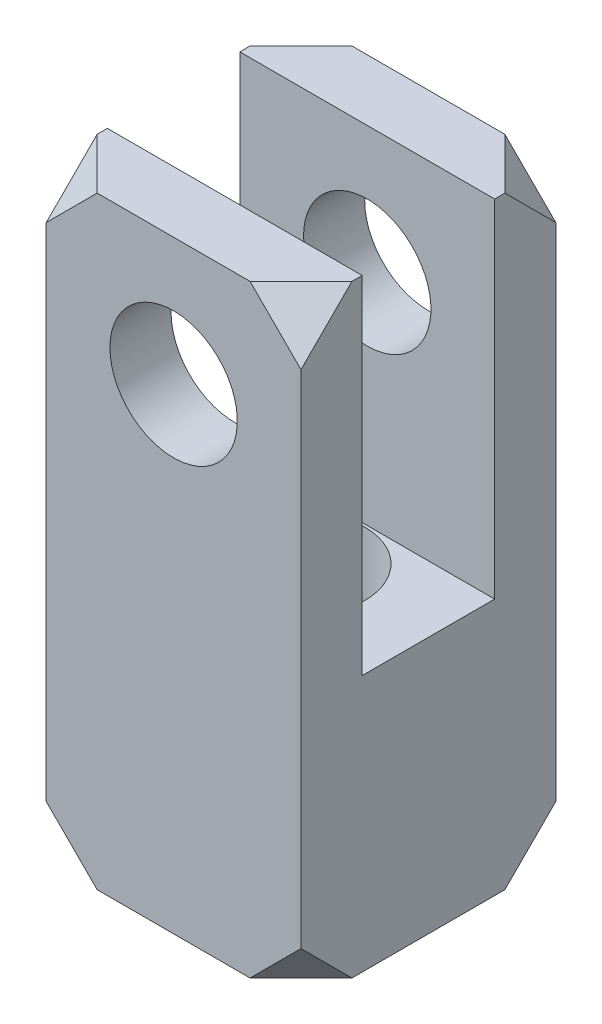
ISO-10303-21;
HEADER;
FILE_DESCRIPTION(('STEP AP214'),'2;1');
FILE_NAME('part.step','',(''),(''),'','','');
FILE_SCHEMA(('AUTOMOTIVE_DESIGN { 1 0 10303 214 1 1 1 1 }'));
ENDSEC;
DATA;
#1=APPLICATION_CONTEXT('core data for automotive mechanical design processes');
#2=APPLICATION_PROTOCOL_DEFINITION('international standard','automotive_design',2000,#1);
#3=PRODUCT_CONTEXT('',#1,'mechanical');
#4=PRODUCT('Part','Part','',(#3));
#5=PRODUCT_RELATED_PRODUCT_CATEGORY('part','',(#4));
#6=PRODUCT_DEFINITION_FORMATION('','',#4);
#7=PRODUCT_DEFINITION_CONTEXT('part definition',#1,'design');
#8=PRODUCT_DEFINITION('design','',#6,#7);
#9=PRODUCT_DEFINITION_SHAPE('','',#8);
#10=(LENGTH_UNIT() NAMED_UNIT(*) SI_UNIT(.MILLI.,.METRE.));
#11=(NAMED_UNIT(*) PLANE_ANGLE_UNIT() SI_UNIT($,.RADIAN.));
#12=(NAMED_UNIT(*) SI_UNIT($,.STERADIAN.) SOLID_ANGLE_UNIT());
#13=UNCERTAINTY_MEASURE_WITH_UNIT(LENGTH_MEASURE(1.E-05),#10,'distance_accuracy_value','');
#14=(GEOMETRIC_REPRESENTATION_CONTEXT(3) GLOBAL_UNCERTAINTY_ASSIGNED_CONTEXT((#13)) GLOBAL_UNIT_ASSIGNED_CONTEXT((#10,
#11,#12)) REPRESENTATION_CONTEXT('',''));
#15=CARTESIAN_POINT('',(0.,0.,0.));
#16=DIRECTION('',(0.,0.,1.));
#17=DIRECTION('',(1.,0.,0.));
#18=AXIS2_PLACEMENT_3D('',#15,#16,#17);
#19=CARTESIAN_POINT('',(0.,0.,12.7));
#20=DIRECTION('',(0.,-1.,0.));
#21=DIRECTION('',(0.,0.,-1.));
#22=AXIS2_PLACEMENT_3D('',#19,#20,#21);
#23=PLANE('',#22);
#24=DIRECTION('',(0.,0.,-1.));
#25=VECTOR('',#24,1.);
#26=CARTESIAN_POINT('',(0.,0.,12.7));
#27=LINE('',#26,#25);
#28=CARTESIAN_POINT('',(0.,0.,3.048));
#29=VERTEX_POINT('',#28);
#30=CARTESIAN_POINT('',(0.,0.,2.54));
#31=VERTEX_POINT('',#30);
#32=EDGE_CURVE('E183',#29,#31,#27,.T.);
#33=ORIENTED_EDGE('',*,*,#32,.F.);
#34=DIRECTION('',(-1.,0.,0.));
#35=VECTOR('',#34,1.);
#36=CARTESIAN_POINT('',(0.,0.,3.048));
#37=LINE('',#36,#35);
#38=CARTESIAN_POINT('',(12.7,0.,3.048));
#39=VERTEX_POINT('',#38);
#40=EDGE_CURVE('E161',#39,#29,#37,.T.);
#41=ORIENTED_EDGE('',*,*,#40,.F.);
#42=DIRECTION('',(0.,0.,-1.));
#43=VECTOR('',#42,1.);
#44=CARTESIAN_POINT('',(12.7,0.,12.7));
#45=LINE('',#44,#43);
#46=CARTESIAN_POINT('',(12.7,0.,2.54));
#47=VERTEX_POINT('',#46);
#48=EDGE_CURVE('E195',#39,#47,#45,.T.);
#49=ORIENTED_EDGE('',*,*,#48,.T.);
#50=DIRECTION('',(0.707106781186548,0.,0.707106781186547));
#51=VECTOR('',#50,1.);
#52=CARTESIAN_POINT('',(11.43,0.,1.27));
#53=LINE('',#52,#51);
#54=CARTESIAN_POINT('',(10.16,0.,0.));
#55=VERTEX_POINT('',#54);
#56=EDGE_CURVE('E230',#55,#47,#53,.T.);
#57=ORIENTED_EDGE('',*,*,#56,.F.);
#58=DIRECTION('',(-1.,0.,0.));
#59=VECTOR('',#58,1.);
#60=CARTESIAN_POINT('',(0.,0.,0.));
#61=LINE('',#60,#59);
#62=CARTESIAN_POINT('',(2.54,0.,0.));
#63=VERTEX_POINT('',#62);
#64=EDGE_CURVE('E176',#55,#63,#61,.T.);
#65=ORIENTED_EDGE('',*,*,#64,.T.);
#66=DIRECTION('',(0.707106781186548,0.,-0.707106781186548));
#67=VECTOR('',#66,1.);
#68=CARTESIAN_POINT('',(-5.08,0.,7.62));
#69=LINE('',#68,#67);
#70=EDGE_CURVE('E221',#31,#63,#69,.T.);
#71=ORIENTED_EDGE('',*,*,#70,.F.);
#72=EDGE_LOOP('',(#33,#41,#49,#57,#65,#71));
#73=FACE_BOUND('',#72,.T.);
#74=ADVANCED_FACE('F33',(#73),#23,.F.);
#75=CARTESIAN_POINT('',(0.,0.,12.7));
#76=DIRECTION('',(0.,0.,1.));
#77=DIRECTION('',(1.,0.,0.));
#78=AXIS2_PLACEMENT_3D('',#75,#76,#77);
#79=PLANE('',#78);
#80=CARTESIAN_POINT('',(6.35,-6.35,12.7));
#81=DIRECTION('',(0.,0.,-1.));
#82=DIRECTION('',(-1.,0.,0.));
#83=AXIS2_PLACEMENT_3D('',#80,#81,#82);
#84=CIRCLE('',#83,3.175);
#85=CARTESIAN_POINT('',(3.175,-6.35,12.7));
#86=VERTEX_POINT('',#85);
#87=EDGE_CURVE('E270',#86,#86,#84,.T.);
#88=ORIENTED_EDGE('',*,*,#87,.T.);
#89=EDGE_LOOP('',(#88));
#90=FACE_BOUND('',#89,.T.);
#91=DIRECTION('',(0.,-1.,0.));
#92=VECTOR('',#91,1.);
#93=CARTESIAN_POINT('',(0.,0.,12.7));
#94=LINE('',#93,#92);
#95=CARTESIAN_POINT('',(0.,-2.54,12.7));
#96=VERTEX_POINT('',#95);
#97=CARTESIAN_POINT('',(0.,-27.5336,12.7));
#98=VERTEX_POINT('',#97);
#99=EDGE_CURVE('E172',#96,#98,#94,.T.);
#100=ORIENTED_EDGE('',*,*,#99,.T.);
#101=DIRECTION('',(0.707106781186548,-0.707106781186547,0.));
#102=VECTOR('',#101,1.);
#103=CARTESIAN_POINT('',(-13.7668,-13.7668,12.7));
#104=LINE('',#103,#102);
#105=CARTESIAN_POINT('',(2.54,-30.0736,12.7));
#106=VERTEX_POINT('',#105);
#107=EDGE_CURVE('E263',#98,#106,#104,.T.);
#108=ORIENTED_EDGE('',*,*,#107,.T.);
#109=DIRECTION('',(1.,0.,0.));
#110=VECTOR('',#109,1.);
#111=CARTESIAN_POINT('',(0.,-30.0736,12.7));
#112=LINE('',#111,#110);
#113=CARTESIAN_POINT('',(10.16,-30.0736,12.7));
#114=VERTEX_POINT('',#113);
#115=EDGE_CURVE('E175',#106,#114,#112,.T.);
#116=ORIENTED_EDGE('',*,*,#115,.T.);
#117=DIRECTION('',(0.707106781186548,0.707106781186547,0.));
#118=VECTOR('',#117,1.);
#119=CARTESIAN_POINT('',(20.1168,-20.1168,12.7));
#120=LINE('',#119,#118);
#121=CARTESIAN_POINT('',(12.7,-27.5336,12.7));
#122=VERTEX_POINT('',#121);
#123=EDGE_CURVE('E254',#114,#122,#120,.T.);
#124=ORIENTED_EDGE('',*,*,#123,.T.);
#125=DIRECTION('',(0.,1.,0.));
#126=VECTOR('',#125,1.);
#127=CARTESIAN_POINT('',(12.7,0.,12.7));
#128=LINE('',#127,#126);
#129=CARTESIAN_POINT('',(12.7,-2.54,12.7));
#130=VERTEX_POINT('',#129);
#131=EDGE_CURVE('E178',#122,#130,#128,.T.);
#132=ORIENTED_EDGE('',*,*,#131,.T.);
#133=DIRECTION('',(-0.707106781186548,0.707106781186547,0.));
#134=VECTOR('',#133,1.);
#135=CARTESIAN_POINT('',(5.08,5.08,12.7));
#136=LINE('',#135,#134);
#137=CARTESIAN_POINT('',(10.16,0.,12.7));
#138=VERTEX_POINT('',#137);
#139=EDGE_CURVE('E207',#130,#138,#136,.T.);
#140=ORIENTED_EDGE('',*,*,#139,.T.);
#141=DIRECTION('',(-1.,0.,0.));
#142=VECTOR('',#141,1.);
#143=CARTESIAN_POINT('',(0.,0.,12.7));
#144=LINE('',#143,#142);
#145=CARTESIAN_POINT('',(2.54,0.,12.7));
#146=VERTEX_POINT('',#145);
#147=EDGE_CURVE('E180',#138,#146,#144,.T.);
#148=ORIENTED_EDGE('',*,*,#147,.T.);
#149=DIRECTION('',(-0.707106781186547,-0.707106781186548,0.));
#150=VECTOR('',#149,1.);
#151=CARTESIAN_POINT('',(1.27,-1.27,12.7));
#152=LINE('',#151,#150);
#153=EDGE_CURVE('E210',#146,#96,#152,.T.);
#154=ORIENTED_EDGE('',*,*,#153,.T.);
#155=EDGE_LOOP('',(#100,#108,#116,#124,#132,#140,#148,#154));
#156=FACE_BOUND('',#155,.T.);
#157=ADVANCED_FACE('F322',(#90,#156),#79,.T.);
#158=CARTESIAN_POINT('',(0.,0.,12.7));
#159=DIRECTION('',(1.,0.,0.));
#160=DIRECTION('',(0.,1.,0.));
#161=AXIS2_PLACEMENT_3D('',#158,#159,#160);
#162=PLANE('',#161);
#163=DIRECTION('',(0.,0.,1.));
#164=VECTOR('',#163,1.);
#165=CARTESIAN_POINT('',(0.,-17.272,9.652));
#166=LINE('',#165,#164);
#167=CARTESIAN_POINT('',(0.,-17.272,3.048));
#168=VERTEX_POINT('',#167);
#169=CARTESIAN_POINT('',(0.,-17.272,9.652));
#170=VERTEX_POINT('',#169);
#171=EDGE_CURVE('E152',#168,#170,#166,.T.);
#172=ORIENTED_EDGE('',*,*,#171,.F.);
#173=DIRECTION('',(0.,1.,0.));
#174=VECTOR('',#173,1.);
#175=CARTESIAN_POINT('',(0.,-17.272,3.048));
#176=LINE('',#175,#174);
#177=EDGE_CURVE('E188',#168,#29,#176,.T.);
#178=ORIENTED_EDGE('',*,*,#177,.T.);
#179=ORIENTED_EDGE('',*,*,#32,.T.);
#180=DIRECTION('',(0.,0.707106781186548,0.707106781186548));
#181=VECTOR('',#180,1.);
#182=CARTESIAN_POINT('',(0.,5.08,7.62));
#183=LINE('',#182,#181);
#184=CARTESIAN_POINT('',(0.,-2.54,0.));
#185=VERTEX_POINT('',#184);
#186=EDGE_CURVE('E218',#185,#31,#183,.T.);
#187=ORIENTED_EDGE('',*,*,#186,.F.);
#188=DIRECTION('',(0.,-1.,0.));
#189=VECTOR('',#188,1.);
#190=CARTESIAN_POINT('',(0.,0.,0.));
#191=LINE('',#190,#189);
#192=CARTESIAN_POINT('',(0.,-27.5336,0.));
#193=VERTEX_POINT('',#192);
#194=EDGE_CURVE('E184',#185,#193,#191,.T.);
#195=ORIENTED_EDGE('',*,*,#194,.T.);
#196=DIRECTION('',(0.,0.707106781186547,-0.707106781186548));
#197=VECTOR('',#196,1.);
#198=CARTESIAN_POINT('',(0.,-20.1168,-7.4168));
#199=LINE('',#198,#197);
#200=CARTESIAN_POINT('',(0.,-30.0736,2.54));
#201=VERTEX_POINT('',#200);
#202=EDGE_CURVE('E236',#201,#193,#199,.T.);
#203=ORIENTED_EDGE('',*,*,#202,.F.);
#204=DIRECTION('',(0.,0.,-1.));
#205=VECTOR('',#204,1.);
#206=CARTESIAN_POINT('',(0.,-30.0736,12.7));
#207=LINE('',#206,#205);
#208=CARTESIAN_POINT('',(0.,-30.0736,10.16));
#209=VERTEX_POINT('',#208);
#210=EDGE_CURVE('E201',#209,#201,#207,.T.);
#211=ORIENTED_EDGE('',*,*,#210,.F.);
#212=DIRECTION('',(0.,-0.707106781186547,-0.707106781186548));
#213=VECTOR('',#212,1.);
#214=CARTESIAN_POINT('',(0.,-13.7668,26.4668));
#215=LINE('',#214,#213);
#216=EDGE_CURVE('E42',#98,#209,#215,.T.);
#217=ORIENTED_EDGE('',*,*,#216,.F.);
#218=ORIENTED_EDGE('',*,*,#99,.F.);
#219=DIRECTION('',(0.,-0.707106781186547,0.707106781186548));
#220=VECTOR('',#219,1.);
#221=CARTESIAN_POINT('',(0.,-1.27,11.43));
#222=LINE('',#221,#220);
#223=CARTESIAN_POINT('',(0.,0.,10.16));
#224=VERTEX_POINT('',#223);
#225=EDGE_CURVE('E212',#224,#96,#222,.T.);
#226=ORIENTED_EDGE('',*,*,#225,.F.);
#227=CARTESIAN_POINT('',(0.,0.,9.652));
#228=VERTEX_POINT('',#227);
#229=EDGE_CURVE('E165',#224,#228,#27,.T.);
#230=ORIENTED_EDGE('',*,*,#229,.T.);
#231=DIRECTION('',(0.,1.,0.));
#232=VECTOR('',#231,1.);
#233=CARTESIAN_POINT('',(0.,-17.272,9.652));
#234=LINE('',#233,#232);
#235=EDGE_CURVE('E50',#170,#228,#234,.T.);
#236=ORIENTED_EDGE('',*,*,#235,.F.);
#237=EDGE_LOOP('',(#172,#178,#179,#187,#195,#203,#211,#217,#218,#226,#230,#236));
#238=FACE_BOUND('',#237,.T.);
#239=ADVANCED_FACE('F35',(#238),#162,.F.);
#240=CARTESIAN_POINT('',(0.,-30.0736,12.7));
#241=DIRECTION('',(0.,1.,0.));
#242=DIRECTION('',(0.,0.,1.));
#243=AXIS2_PLACEMENT_3D('',#240,#241,#242);
#244=PLANE('',#243);
#245=CARTESIAN_POINT('',(6.35,-30.0736,6.35));
#246=DIRECTION('',(0.,-1.,0.));
#247=DIRECTION('',(0.,0.,-1.));
#248=AXIS2_PLACEMENT_3D('',#245,#246,#247);
#249=CIRCLE('',#248,3.175);
#250=CARTESIAN_POINT('',(6.35,-30.0736,3.175));
#251=VERTEX_POINT('',#250);
#252=EDGE_CURVE('E284',#251,#251,#249,.T.);
#253=ORIENTED_EDGE('',*,*,#252,.F.);
#254=EDGE_LOOP('',(#253));
#255=FACE_BOUND('',#254,.T.);
#256=DIRECTION('',(0.707106781186547,0.,0.707106781186548));
#257=VECTOR('',#256,1.);
#258=CARTESIAN_POINT('',(1.27,-30.0736,11.43));
#259=LINE('',#258,#257);
#260=EDGE_CURVE('E11',#209,#106,#259,.T.);
#261=ORIENTED_EDGE('',*,*,#260,.F.);
#262=ORIENTED_EDGE('',*,*,#210,.T.);
#263=DIRECTION('',(-0.707106781186547,0.,0.707106781186548));
#264=VECTOR('',#263,1.);
#265=CARTESIAN_POINT('',(-5.08,-30.0736,7.62));
#266=LINE('',#265,#264);
#267=CARTESIAN_POINT('',(2.54000000000001,-30.0736,0.));
#268=VERTEX_POINT('',#267);
#269=EDGE_CURVE('E239',#268,#201,#266,.T.);
#270=ORIENTED_EDGE('',*,*,#269,.F.);
#271=DIRECTION('',(1.,0.,0.));
#272=VECTOR('',#271,1.);
#273=CARTESIAN_POINT('',(0.,-30.0736,0.));
#274=LINE('',#273,#272);
#275=CARTESIAN_POINT('',(10.16,-30.0736,0.));
#276=VERTEX_POINT('',#275);
#277=EDGE_CURVE('E187',#268,#276,#274,.T.);
#278=ORIENTED_EDGE('',*,*,#277,.T.);
#279=DIRECTION('',(-0.707106781186548,0.,-0.707106781186547));
#280=VECTOR('',#279,1.);
#281=CARTESIAN_POINT('',(11.43,-30.0736,1.27));
#282=LINE('',#281,#280);
#283=CARTESIAN_POINT('',(12.7,-30.0736,2.53999999999999));
#284=VERTEX_POINT('',#283);
#285=EDGE_CURVE('E245',#284,#276,#282,.T.);
#286=ORIENTED_EDGE('',*,*,#285,.F.);
#287=DIRECTION('',(0.,0.,-1.));
#288=VECTOR('',#287,1.);
#289=CARTESIAN_POINT('',(12.7,-30.0736,12.7));
#290=LINE('',#289,#288);
#291=CARTESIAN_POINT('',(12.7,-30.0736,10.16));
#292=VERTEX_POINT('',#291);
#293=EDGE_CURVE('E199',#292,#284,#290,.T.);
#294=ORIENTED_EDGE('',*,*,#293,.F.);
#295=DIRECTION('',(0.707106781186548,0.,-0.707106781186548));
#296=VECTOR('',#295,1.);
#297=CARTESIAN_POINT('',(5.08,-30.0736,17.78));
#298=LINE('',#297,#296);
#299=EDGE_CURVE('E257',#114,#292,#298,.T.);
#300=ORIENTED_EDGE('',*,*,#299,.F.);
#301=ORIENTED_EDGE('',*,*,#115,.F.);
#302=EDGE_LOOP('',(#261,#262,#270,#278,#286,#294,#300,#301));
#303=FACE_BOUND('',#302,.T.);
#304=ADVANCED_FACE('F315',(#255,#303),#244,.F.);
#305=CARTESIAN_POINT('',(12.7,0.,12.7));
#306=DIRECTION('',(-1.,0.,0.));
#307=DIRECTION('',(0.,-1.,0.));
#308=AXIS2_PLACEMENT_3D('',#305,#306,#307);
#309=PLANE('',#308);
#310=ORIENTED_EDGE('',*,*,#48,.F.);
#311=DIRECTION('',(0.,1.,0.));
#312=VECTOR('',#311,1.);
#313=CARTESIAN_POINT('',(12.7,-17.272,3.048));
#314=LINE('',#313,#312);
#315=CARTESIAN_POINT('',(12.7,-17.272,3.048));
#316=VERTEX_POINT('',#315);
#317=EDGE_CURVE('E167',#316,#39,#314,.T.);
#318=ORIENTED_EDGE('',*,*,#317,.F.);
#319=DIRECTION('',(0.,0.,-1.));
#320=VECTOR('',#319,1.);
#321=CARTESIAN_POINT('',(12.7,-17.272,9.652));
#322=LINE('',#321,#320);
#323=CARTESIAN_POINT('',(12.7,-17.272,9.652));
#324=VERTEX_POINT('',#323);
#325=EDGE_CURVE('E151',#324,#316,#322,.T.);
#326=ORIENTED_EDGE('',*,*,#325,.F.);
#327=DIRECTION('',(0.,1.,0.));
#328=VECTOR('',#327,1.);
#329=CARTESIAN_POINT('',(12.7,-17.272,9.652));
#330=LINE('',#329,#328);
#331=CARTESIAN_POINT('',(12.7,0.,9.652));
#332=VERTEX_POINT('',#331);
#333=EDGE_CURVE('E148',#324,#332,#330,.T.);
#334=ORIENTED_EDGE('',*,*,#333,.T.);
#335=CARTESIAN_POINT('',(12.7,0.,10.16));
#336=VERTEX_POINT('',#335);
#337=EDGE_CURVE('E196',#336,#332,#45,.T.);
#338=ORIENTED_EDGE('',*,*,#337,.F.);
#339=DIRECTION('',(0.,0.707106781186547,-0.707106781186547));
#340=VECTOR('',#339,1.);
#341=CARTESIAN_POINT('',(12.7,-1.27,11.43));
#342=LINE('',#341,#340);
#343=EDGE_CURVE('E203',#130,#336,#342,.T.);
#344=ORIENTED_EDGE('',*,*,#343,.F.);
#345=ORIENTED_EDGE('',*,*,#131,.F.);
#346=DIRECTION('',(0.,0.707106781186547,0.707106781186548));
#347=VECTOR('',#346,1.);
#348=CARTESIAN_POINT('',(12.7,-13.7668,26.4668));
#349=LINE('',#348,#347);
#350=EDGE_CURVE('E260',#292,#122,#349,.T.);
#351=ORIENTED_EDGE('',*,*,#350,.F.);
#352=ORIENTED_EDGE('',*,*,#293,.T.);
#353=DIRECTION('',(0.,-0.707106781186547,0.707106781186548));
#354=VECTOR('',#353,1.);
#355=CARTESIAN_POINT('',(12.7,-20.1168,-7.4168));
#356=LINE('',#355,#354);
#357=CARTESIAN_POINT('',(12.7,-27.5336,0.));
#358=VERTEX_POINT('',#357);
#359=EDGE_CURVE('E248',#358,#284,#356,.T.);
#360=ORIENTED_EDGE('',*,*,#359,.F.);
#361=DIRECTION('',(0.,1.,0.));
#362=VECTOR('',#361,1.);
#363=CARTESIAN_POINT('',(12.7,0.,0.));
#364=LINE('',#363,#362);
#365=CARTESIAN_POINT('',(12.7,-2.54,0.));
#366=VERTEX_POINT('',#365);
#367=EDGE_CURVE('E191',#358,#366,#364,.T.);
#368=ORIENTED_EDGE('',*,*,#367,.T.);
#369=DIRECTION('',(0.,-0.707106781186548,-0.707106781186547));
#370=VECTOR('',#369,1.);
#371=CARTESIAN_POINT('',(12.7,5.08,7.62));
#372=LINE('',#371,#370);
#373=EDGE_CURVE('E227',#47,#366,#372,.T.);
#374=ORIENTED_EDGE('',*,*,#373,.F.);
#375=EDGE_LOOP('',(#310,#318,#326,#334,#338,#344,#345,#351,#352,#360,#368,#374));
#376=FACE_BOUND('',#375,.T.);
#377=ADVANCED_FACE('F300',(#376),#309,.F.);
#378=ORIENTED_EDGE('',*,*,#337,.T.);
#379=DIRECTION('',(1.,0.,0.));
#380=VECTOR('',#379,1.);
#381=CARTESIAN_POINT('',(0.,0.,9.652));
#382=LINE('',#381,#380);
#383=EDGE_CURVE('E274',#228,#332,#382,.T.);
#384=ORIENTED_EDGE('',*,*,#383,.F.);
#385=ORIENTED_EDGE('',*,*,#229,.F.);
#386=DIRECTION('',(-0.707106781186547,0.,-0.707106781186548));
#387=VECTOR('',#386,1.);
#388=CARTESIAN_POINT('',(1.27,0.,11.43));
#389=LINE('',#388,#387);
#390=EDGE_CURVE('E215',#146,#224,#389,.T.);
#391=ORIENTED_EDGE('',*,*,#390,.F.);
#392=ORIENTED_EDGE('',*,*,#147,.F.);
#393=DIRECTION('',(-0.707106781186547,0.,0.707106781186547));
#394=VECTOR('',#393,1.);
#395=CARTESIAN_POINT('',(5.08,0.,17.78));
#396=LINE('',#395,#394);
#397=EDGE_CURVE('E205',#336,#138,#396,.T.);
#398=ORIENTED_EDGE('',*,*,#397,.F.);
#399=EDGE_LOOP('',(#378,#384,#385,#391,#392,#398));
#400=FACE_BOUND('',#399,.T.);
#401=ADVANCED_FACE('F329',(#400),#23,.F.);
#402=CARTESIAN_POINT('',(0.,0.,0.));
#403=DIRECTION('',(0.,0.,1.));
#404=DIRECTION('',(1.,0.,0.));
#405=AXIS2_PLACEMENT_3D('',#402,#403,#404);
#406=PLANE('',#405);
#407=CARTESIAN_POINT('',(6.35,-6.35,0.));
#408=DIRECTION('',(0.,0.,-1.));
#409=DIRECTION('',(-1.,0.,0.));
#410=AXIS2_PLACEMENT_3D('',#407,#408,#409);
#411=CIRCLE('',#410,3.175);
#412=CARTESIAN_POINT('',(3.175,-6.35,0.));
#413=VERTEX_POINT('',#412);
#414=EDGE_CURVE('E277',#413,#413,#411,.T.);
#415=ORIENTED_EDGE('',*,*,#414,.F.);
#416=EDGE_LOOP('',(#415));
#417=FACE_BOUND('',#416,.T.);
#418=DIRECTION('',(0.707106781186548,0.707106781186547,0.));
#419=VECTOR('',#418,1.);
#420=CARTESIAN_POINT('',(20.1168,-20.1168,0.));
#421=LINE('',#420,#419);
#422=EDGE_CURVE('E251',#276,#358,#421,.T.);
#423=ORIENTED_EDGE('',*,*,#422,.F.);
#424=ORIENTED_EDGE('',*,*,#277,.F.);
#425=DIRECTION('',(0.707106781186548,-0.707106781186547,0.));
#426=VECTOR('',#425,1.);
#427=CARTESIAN_POINT('',(-13.7668,-13.7668,0.));
#428=LINE('',#427,#426);
#429=EDGE_CURVE('E242',#193,#268,#428,.T.);
#430=ORIENTED_EDGE('',*,*,#429,.F.);
#431=ORIENTED_EDGE('',*,*,#194,.F.);
#432=DIRECTION('',(-0.707106781186547,-0.707106781186548,0.));
#433=VECTOR('',#432,1.);
#434=CARTESIAN_POINT('',(1.27,-1.27,0.));
#435=LINE('',#434,#433);
#436=EDGE_CURVE('E224',#63,#185,#435,.T.);
#437=ORIENTED_EDGE('',*,*,#436,.F.);
#438=ORIENTED_EDGE('',*,*,#64,.F.);
#439=DIRECTION('',(-0.707106781186548,0.707106781186547,0.));
#440=VECTOR('',#439,1.);
#441=CARTESIAN_POINT('',(5.08,5.08,0.));
#442=LINE('',#441,#440);
#443=EDGE_CURVE('E233',#366,#55,#442,.T.);
#444=ORIENTED_EDGE('',*,*,#443,.F.);
#445=ORIENTED_EDGE('',*,*,#367,.F.);
#446=EDGE_LOOP('',(#423,#424,#430,#431,#437,#438,#444,#445));
#447=FACE_BOUND('',#446,.T.);
#448=ADVANCED_FACE('F307',(#417,#447),#406,.F.);
#449=CARTESIAN_POINT('',(7.62,7.62,7.62));
#450=DIRECTION('',(0.577350269189626,0.577350269189626,0.577350269189626));
#451=DIRECTION('',(0.,-0.707106781186547,0.707106781186548));
#452=AXIS2_PLACEMENT_3D('',#449,#450,#451);
#453=PLANE('',#452);
#454=ORIENTED_EDGE('',*,*,#139,.F.);
#455=ORIENTED_EDGE('',*,*,#343,.T.);
#456=ORIENTED_EDGE('',*,*,#397,.T.);
#457=EDGE_LOOP('',(#454,#455,#456));
#458=FACE_BOUND('',#457,.T.);
#459=ADVANCED_FACE('F334',(#458),#453,.T.);
#460=CARTESIAN_POINT('',(-3.38666666666667,3.38666666666667,3.38666666666667));
#461=DIRECTION('',(-0.577350269189626,0.577350269189626,0.577350269189626));
#462=DIRECTION('',(-0.707106781186547,-0.707106781186548,0.));
#463=AXIS2_PLACEMENT_3D('',#460,#461,#462);
#464=PLANE('',#463);
#465=ORIENTED_EDGE('',*,*,#153,.F.);
#466=ORIENTED_EDGE('',*,*,#390,.T.);
#467=ORIENTED_EDGE('',*,*,#225,.T.);
#468=EDGE_LOOP('',(#465,#466,#467));
#469=FACE_BOUND('',#468,.T.);
#470=ADVANCED_FACE('F326',(#469),#464,.T.);
#471=CARTESIAN_POINT('',(0.846666666666667,-0.846666666666667,0.846666666666667));
#472=DIRECTION('',(-0.577350269189626,0.577350269189626,-0.577350269189626));
#473=DIRECTION('',(-0.707106781186548,0.,0.707106781186548));
#474=AXIS2_PLACEMENT_3D('',#471,#472,#473);
#475=PLANE('',#474);
#476=ORIENTED_EDGE('',*,*,#436,.T.);
#477=ORIENTED_EDGE('',*,*,#186,.T.);
#478=ORIENTED_EDGE('',*,*,#70,.T.);
#479=EDGE_LOOP('',(#476,#477,#478));
#480=FACE_BOUND('',#479,.T.);
#481=ADVANCED_FACE('F310',(#480),#475,.T.);
#482=CARTESIAN_POINT('',(3.38666666666666,3.38666666666666,-3.38666666666666));
#483=DIRECTION('',(0.577350269189626,0.577350269189626,-0.577350269189626));
#484=DIRECTION('',(0.,0.707106781186548,0.707106781186548));
#485=AXIS2_PLACEMENT_3D('',#482,#483,#484);
#486=PLANE('',#485);
#487=ORIENTED_EDGE('',*,*,#56,.T.);
#488=ORIENTED_EDGE('',*,*,#373,.T.);
#489=ORIENTED_EDGE('',*,*,#443,.T.);
#490=EDGE_LOOP('',(#487,#488,#489));
#491=FACE_BOUND('',#490,.T.);
#492=ADVANCED_FACE('F304',(#491),#486,.T.);
#493=CARTESIAN_POINT('',(-9.17786666666667,-9.17786666666667,-9.17786666666667));
#494=DIRECTION('',(-0.577350269189626,-0.577350269189626,-0.577350269189626));
#495=DIRECTION('',(0.707106781186548,-0.707106781186547,0.));
#496=AXIS2_PLACEMENT_3D('',#493,#494,#495);
#497=PLANE('',#496);
#498=ORIENTED_EDGE('',*,*,#269,.T.);
#499=ORIENTED_EDGE('',*,*,#202,.T.);
#500=ORIENTED_EDGE('',*,*,#429,.T.);
#501=EDGE_LOOP('',(#498,#499,#500));
#502=FACE_BOUND('',#501,.T.);
#503=ADVANCED_FACE('F313',(#502),#497,.T.);
#504=CARTESIAN_POINT('',(13.4112,-13.4112,-13.4112));
#505=DIRECTION('',(0.577350269189626,-0.577350269189626,-0.577350269189626));
#506=DIRECTION('',(0.,0.707106781186547,-0.707106781186548));
#507=AXIS2_PLACEMENT_3D('',#504,#505,#506);
#508=PLANE('',#507);
#509=ORIENTED_EDGE('',*,*,#359,.T.);
#510=ORIENTED_EDGE('',*,*,#285,.T.);
#511=ORIENTED_EDGE('',*,*,#422,.T.);
#512=EDGE_LOOP('',(#509,#510,#511));
#513=FACE_BOUND('',#512,.T.);
#514=ADVANCED_FACE('F341',(#513),#508,.T.);
#515=CARTESIAN_POINT('',(17.6445333333333,-17.6445333333333,17.6445333333333));
#516=DIRECTION('',(0.577350269189626,-0.577350269189626,0.577350269189626));
#517=DIRECTION('',(0.,-0.707106781186547,-0.707106781186548));
#518=AXIS2_PLACEMENT_3D('',#515,#516,#517);
#519=PLANE('',#518);
#520=ORIENTED_EDGE('',*,*,#123,.F.);
#521=ORIENTED_EDGE('',*,*,#299,.T.);
#522=ORIENTED_EDGE('',*,*,#350,.T.);
#523=EDGE_LOOP('',(#520,#521,#522));
#524=FACE_BOUND('',#523,.T.);
#525=ADVANCED_FACE('F339',(#524),#519,.T.);
#526=CARTESIAN_POINT('',(-13.4112,-13.4112,13.4112));
#527=DIRECTION('',(-0.577350269189626,-0.577350269189626,0.577350269189626));
#528=DIRECTION('',(0.707106781186548,-0.707106781186547,0.));
#529=AXIS2_PLACEMENT_3D('',#526,#527,#528);
#530=PLANE('',#529);
#531=ORIENTED_EDGE('',*,*,#107,.F.);
#532=ORIENTED_EDGE('',*,*,#216,.T.);
#533=ORIENTED_EDGE('',*,*,#260,.T.);
#534=EDGE_LOOP('',(#531,#532,#533));
#535=FACE_BOUND('',#534,.T.);
#536=ADVANCED_FACE('F320',(#535),#530,.T.);
#537=CARTESIAN_POINT('',(0.,-17.272,3.048));
#538=DIRECTION('',(0.,0.,-1.));
#539=DIRECTION('',(-1.,0.,0.));
#540=AXIS2_PLACEMENT_3D('',#537,#538,#539);
#541=PLANE('',#540);
#542=CARTESIAN_POINT('',(6.35,-6.35,3.048));
#543=DIRECTION('',(0.,0.,-1.));
#544=DIRECTION('',(-1.,0.,0.));
#545=AXIS2_PLACEMENT_3D('',#542,#543,#544);
#546=CIRCLE('',#545,3.175);
#547=CARTESIAN_POINT('',(3.175,-6.35,3.048));
#548=VERTEX_POINT('',#547);
#549=EDGE_CURVE('E269',#548,#548,#546,.T.);
#550=ORIENTED_EDGE('',*,*,#549,.T.);
#551=EDGE_LOOP('',(#550));
#552=FACE_BOUND('',#551,.T.);
#553=ORIENTED_EDGE('',*,*,#40,.T.);
#554=ORIENTED_EDGE('',*,*,#177,.F.);
#555=DIRECTION('',(-1.,0.,0.));
#556=VECTOR('',#555,1.);
#557=CARTESIAN_POINT('',(0.,-17.272,3.048));
#558=LINE('',#557,#556);
#559=EDGE_CURVE('E158',#316,#168,#558,.T.);
#560=ORIENTED_EDGE('',*,*,#559,.F.);
#561=ORIENTED_EDGE('',*,*,#317,.T.);
#562=EDGE_LOOP('',(#553,#554,#560,#561));
#563=FACE_BOUND('',#562,.T.);
#564=ADVANCED_FACE('F292',(#552,#563),#541,.F.);
#565=CARTESIAN_POINT('',(0.,-17.272,9.652));
#566=DIRECTION('',(0.,0.,1.));
#567=DIRECTION('',(1.,0.,0.));
#568=AXIS2_PLACEMENT_3D('',#565,#566,#567);
#569=PLANE('',#568);
#570=CARTESIAN_POINT('',(6.35,-6.35,9.652));
#571=DIRECTION('',(0.,0.,1.));
#572=DIRECTION('',(1.,0.,0.));
#573=AXIS2_PLACEMENT_3D('',#570,#571,#572);
#574=CIRCLE('',#573,3.175);
#575=CARTESIAN_POINT('',(3.175,-6.35,9.652));
#576=VERTEX_POINT('',#575);
#577=EDGE_CURVE('E267',#576,#576,#574,.T.);
#578=ORIENTED_EDGE('',*,*,#577,.T.);
#579=EDGE_LOOP('',(#578));
#580=FACE_BOUND('',#579,.T.);
#581=ORIENTED_EDGE('',*,*,#383,.T.);
#582=ORIENTED_EDGE('',*,*,#333,.F.);
#583=DIRECTION('',(1.,0.,0.));
#584=VECTOR('',#583,1.);
#585=CARTESIAN_POINT('',(0.,-17.272,9.652));
#586=LINE('',#585,#584);
#587=EDGE_CURVE('E144',#170,#324,#586,.T.);
#588=ORIENTED_EDGE('',*,*,#587,.F.);
#589=ORIENTED_EDGE('',*,*,#235,.T.);
#590=EDGE_LOOP('',(#581,#582,#588,#589));
#591=FACE_BOUND('',#590,.T.);
#592=ADVANCED_FACE('F146',(#580,#591),#569,.F.);
#593=CARTESIAN_POINT('',(0.,-17.272,0.));
#594=DIRECTION('',(0.,-1.,0.));
#595=DIRECTION('',(0.,0.,-1.));
#596=AXIS2_PLACEMENT_3D('',#593,#594,#595);
#597=PLANE('',#596);
#598=CARTESIAN_POINT('',(6.35,-17.272,6.35));
#599=DIRECTION('',(0.,-1.,0.));
#600=DIRECTION('',(0.,0.,-1.));
#601=AXIS2_PLACEMENT_3D('',#598,#599,#600);
#602=CIRCLE('',#601,3.175);
#603=CARTESIAN_POINT('',(6.35,-17.272,3.175));
#604=VERTEX_POINT('',#603);
#605=EDGE_CURVE('E37',#604,#604,#602,.T.);
#606=ORIENTED_EDGE('',*,*,#605,.T.);
#607=EDGE_LOOP('',(#606));
#608=FACE_BOUND('',#607,.T.);
#609=ORIENTED_EDGE('',*,*,#171,.T.);
#610=ORIENTED_EDGE('',*,*,#587,.T.);
#611=ORIENTED_EDGE('',*,*,#325,.T.);
#612=ORIENTED_EDGE('',*,*,#559,.T.);
#613=EDGE_LOOP('',(#609,#610,#611,#612));
#614=FACE_BOUND('',#613,.T.);
#615=ADVANCED_FACE('F156',(#608,#614),#597,.F.);
#616=CARTESIAN_POINT('',(6.35,-6.35,12.7));
#617=DIRECTION('',(0.,0.,-1.));
#618=DIRECTION('',(-1.,0.,0.));
#619=AXIS2_PLACEMENT_3D('',#616,#617,#618);
#620=CYLINDRICAL_SURFACE('',#619,3.175);
#621=CARTESIAN_POINT('',(3.175,-6.35,12.7));
#622=CARTESIAN_POINT('',(3.175,-6.35,12.66825));
#623=CARTESIAN_POINT('',(3.175,-6.35,12.6365));
#624=CARTESIAN_POINT('',(3.175,-6.35,12.573));
#625=CARTESIAN_POINT('',(3.175,-6.35,12.54125));
#626=CARTESIAN_POINT('',(3.175,-6.35,12.47775));
#627=CARTESIAN_POINT('',(3.175,-6.35,12.446));
#628=CARTESIAN_POINT('',(3.175,-6.35,12.3825));
#629=CARTESIAN_POINT('',(3.175,-6.35,12.35075));
#630=CARTESIAN_POINT('',(3.175,-6.35,12.28725));
#631=CARTESIAN_POINT('',(3.175,-6.35,12.2555));
#632=CARTESIAN_POINT('',(3.175,-6.35,12.192));
#633=CARTESIAN_POINT('',(3.175,-6.35,12.16025));
#634=CARTESIAN_POINT('',(3.175,-6.35,12.09675));
#635=CARTESIAN_POINT('',(3.175,-6.35,12.065));
#636=CARTESIAN_POINT('',(3.175,-6.35,12.0015));
#637=CARTESIAN_POINT('',(3.175,-6.35,11.96975));
#638=CARTESIAN_POINT('',(3.175,-6.35,11.90625));
#639=CARTESIAN_POINT('',(3.175,-6.35,11.8745));
#640=CARTESIAN_POINT('',(3.175,-6.35,11.811));
#641=CARTESIAN_POINT('',(3.175,-6.35,11.77925));
#642=CARTESIAN_POINT('',(3.175,-6.35,11.71575));
#643=CARTESIAN_POINT('',(3.175,-6.35,11.684));
#644=CARTESIAN_POINT('',(3.175,-6.35,11.6205));
#645=CARTESIAN_POINT('',(3.175,-6.35,11.58875));
#646=CARTESIAN_POINT('',(3.175,-6.35,11.52525));
#647=CARTESIAN_POINT('',(3.175,-6.35,11.4935));
#648=CARTESIAN_POINT('',(3.175,-6.35,11.43));
#649=CARTESIAN_POINT('',(3.175,-6.35,11.39825));
#650=CARTESIAN_POINT('',(3.175,-6.35,11.33475));
#651=CARTESIAN_POINT('',(3.175,-6.35,11.303));
#652=CARTESIAN_POINT('',(3.175,-6.35,11.2395));
#653=CARTESIAN_POINT('',(3.175,-6.35,11.20775));
#654=CARTESIAN_POINT('',(3.175,-6.35,11.14425));
#655=CARTESIAN_POINT('',(3.175,-6.35,11.1125));
#656=CARTESIAN_POINT('',(3.175,-6.35,11.049));
#657=CARTESIAN_POINT('',(3.175,-6.35,11.01725));
#658=CARTESIAN_POINT('',(3.175,-6.35,10.95375));
#659=CARTESIAN_POINT('',(3.175,-6.35,10.922));
#660=CARTESIAN_POINT('',(3.175,-6.35,10.8585));
#661=CARTESIAN_POINT('',(3.175,-6.35,10.82675));
#662=CARTESIAN_POINT('',(3.175,-6.35,10.76325));
#663=CARTESIAN_POINT('',(3.175,-6.35,10.7315));
#664=CARTESIAN_POINT('',(3.175,-6.35,10.668));
#665=CARTESIAN_POINT('',(3.175,-6.35,10.63625));
#666=CARTESIAN_POINT('',(3.175,-6.35,10.57275));
#667=CARTESIAN_POINT('',(3.175,-6.35,10.541));
#668=CARTESIAN_POINT('',(3.175,-6.35,10.4775));
#669=CARTESIAN_POINT('',(3.175,-6.35,10.44575));
#670=CARTESIAN_POINT('',(3.175,-6.35,10.38225));
#671=CARTESIAN_POINT('',(3.175,-6.35,10.3505));
#672=CARTESIAN_POINT('',(3.175,-6.35,10.287));
#673=CARTESIAN_POINT('',(3.175,-6.35,10.25525));
#674=CARTESIAN_POINT('',(3.175,-6.35,10.19175));
#675=CARTESIAN_POINT('',(3.175,-6.35,10.16));
#676=CARTESIAN_POINT('',(3.175,-6.35,10.0965));
#677=CARTESIAN_POINT('',(3.175,-6.35,10.06475));
#678=CARTESIAN_POINT('',(3.175,-6.35,10.00125));
#679=CARTESIAN_POINT('',(3.175,-6.35,9.9695));
#680=CARTESIAN_POINT('',(3.175,-6.35,9.906));
#681=CARTESIAN_POINT('',(3.175,-6.35,9.87425));
#682=CARTESIAN_POINT('',(3.175,-6.35,9.81075));
#683=CARTESIAN_POINT('',(3.175,-6.35,9.779));
#684=CARTESIAN_POINT('',(3.175,-6.35,9.7155));
#685=CARTESIAN_POINT('',(3.175,-6.35,9.68375));
#686=CARTESIAN_POINT('',(3.175,-6.35,9.652));
#687=B_SPLINE_CURVE_WITH_KNOTS('',3,(#621,#622,#623,#624,#625,#626,#627,#628,#629,#630,#631,
#632,#633,#634,#635,#636,#637,#638,#639,#640,#641,#642,#643,#644,#645,#646,#647,#648,#649,#650,
#651,#652,#653,#654,#655,#656,#657,#658,#659,#660,#661,#662,#663,#664,#665,#666,#667,#668,#669,
#670,#671,#672,#673,#674,#675,#676,#677,#678,#679,#680,#681,#682,#683,#684,#685,#686),
.UNSPECIFIED.,.F.,.F.,(4,2,2,2,2,2,2,2,2,2,2,2,2,2,2,2,2,2,2,2,2,2,2,2,2,2,2,2,2,2,2,2,4),(0.,
0.0952499999999998,0.1905,0.28575,0.380999999999999,0.476249999999999,0.571499999999999,
0.666750000000001,0.762000000000001,0.85725,0.9525,1.04775,1.143,1.23825,1.3335,1.42875,1.524,
1.61925,1.7145,1.80975,1.905,2.00025,2.0955,2.19075,2.286,2.38125,2.4765,2.57175,2.667,2.76225,
2.8575,2.95275,3.048),.UNSPECIFIED.);
#688=EDGE_CURVE('BSEAM385',#86,#576,#687,.T.);
#689=ORIENTED_EDGE('',*,*,#87,.F.);
#690=ORIENTED_EDGE('',*,*,#577,.F.);
#691=ORIENTED_EDGE('',*,*,#688,.T.);
#692=ORIENTED_EDGE('',*,*,#688,.F.);
#693=EDGE_LOOP('',(#689,#691,#690,#692));
#694=FACE_BOUND('',#693,.T.);
#695=ADVANCED_FACE('F385',(#694),#620,.F.);
#696=CARTESIAN_POINT('',(3.175,-6.35,0.));
#697=CARTESIAN_POINT('',(3.175,-6.35,0.03175));
#698=CARTESIAN_POINT('',(3.175,-6.35,0.0634999999999999));
#699=CARTESIAN_POINT('',(3.175,-6.35,0.127));
#700=CARTESIAN_POINT('',(3.175,-6.35,0.15875));
#701=CARTESIAN_POINT('',(3.175,-6.35,0.22225));
#702=CARTESIAN_POINT('',(3.175,-6.35,0.254));
#703=CARTESIAN_POINT('',(3.175,-6.35,0.3175));
#704=CARTESIAN_POINT('',(3.175,-6.35,0.349249999999999));
#705=CARTESIAN_POINT('',(3.175,-6.35,0.41275));
#706=CARTESIAN_POINT('',(3.175,-6.35,0.4445));
#707=CARTESIAN_POINT('',(3.175,-6.35,0.508000000000001));
#708=CARTESIAN_POINT('',(3.175,-6.35,0.539750000000001));
#709=CARTESIAN_POINT('',(3.175,-6.35,0.603250000000001));
#710=CARTESIAN_POINT('',(3.175,-6.35,0.635000000000001));
#711=CARTESIAN_POINT('',(3.175,-6.35,0.698500000000001));
#712=CARTESIAN_POINT('',(3.175,-6.35,0.730250000000001));
#713=CARTESIAN_POINT('',(3.175,-6.35,0.793750000000001));
#714=CARTESIAN_POINT('',(3.175,-6.35,0.8255));
#715=CARTESIAN_POINT('',(3.175,-6.35,0.889));
#716=CARTESIAN_POINT('',(3.175,-6.35,0.92075));
#717=CARTESIAN_POINT('',(3.175,-6.35,0.98425));
#718=CARTESIAN_POINT('',(3.175,-6.35,1.016));
#719=CARTESIAN_POINT('',(3.175,-6.35,1.0795));
#720=CARTESIAN_POINT('',(3.175,-6.35,1.11125));
#721=CARTESIAN_POINT('',(3.175,-6.35,1.17475));
#722=CARTESIAN_POINT('',(3.175,-6.35,1.2065));
#723=CARTESIAN_POINT('',(3.175,-6.35,1.27));
#724=CARTESIAN_POINT('',(3.175,-6.35,1.30175));
#725=CARTESIAN_POINT('',(3.175,-6.35,1.36525));
#726=CARTESIAN_POINT('',(3.175,-6.35,1.397));
#727=CARTESIAN_POINT('',(3.175,-6.35,1.4605));
#728=CARTESIAN_POINT('',(3.175,-6.35,1.49225));
#729=CARTESIAN_POINT('',(3.175,-6.35,1.55575));
#730=CARTESIAN_POINT('',(3.175,-6.35,1.5875));
#731=CARTESIAN_POINT('',(3.175,-6.35,1.651));
#732=CARTESIAN_POINT('',(3.175,-6.35,1.68275));
#733=CARTESIAN_POINT('',(3.175,-6.35,1.74625));
#734=CARTESIAN_POINT('',(3.175,-6.35,1.778));
#735=CARTESIAN_POINT('',(3.175,-6.35,1.8415));
#736=CARTESIAN_POINT('',(3.175,-6.35,1.87325));
#737=CARTESIAN_POINT('',(3.175,-6.35,1.93675));
#738=CARTESIAN_POINT('',(3.175,-6.35,1.9685));
#739=CARTESIAN_POINT('',(3.175,-6.35,2.032));
#740=CARTESIAN_POINT('',(3.175,-6.35,2.06375));
#741=CARTESIAN_POINT('',(3.175,-6.35,2.12725));
#742=CARTESIAN_POINT('',(3.175,-6.35,2.159));
#743=CARTESIAN_POINT('',(3.175,-6.35,2.2225));
#744=CARTESIAN_POINT('',(3.175,-6.35,2.25425));
#745=CARTESIAN_POINT('',(3.175,-6.35,2.31775));
#746=CARTESIAN_POINT('',(3.175,-6.35,2.3495));
#747=CARTESIAN_POINT('',(3.175,-6.35,2.413));
#748=CARTESIAN_POINT('',(3.175,-6.35,2.44475));
#749=CARTESIAN_POINT('',(3.175,-6.35,2.50825));
#750=CARTESIAN_POINT('',(3.175,-6.35,2.54));
#751=CARTESIAN_POINT('',(3.175,-6.35,2.6035));
#752=CARTESIAN_POINT('',(3.175,-6.35,2.63525));
#753=CARTESIAN_POINT('',(3.175,-6.35,2.69875));
#754=CARTESIAN_POINT('',(3.175,-6.35,2.7305));
#755=CARTESIAN_POINT('',(3.175,-6.35,2.794));
#756=CARTESIAN_POINT('',(3.175,-6.35,2.82575));
#757=CARTESIAN_POINT('',(3.175,-6.35,2.88925));
#758=CARTESIAN_POINT('',(3.175,-6.35,2.921));
#759=CARTESIAN_POINT('',(3.175,-6.35,2.9845));
#760=CARTESIAN_POINT('',(3.175,-6.35,3.01625));
#761=CARTESIAN_POINT('',(3.175,-6.35,3.048));
#762=B_SPLINE_CURVE_WITH_KNOTS('',3,(#696,#697,#698,#699,#700,#701,#702,#703,#704,#705,#706,
#707,#708,#709,#710,#711,#712,#713,#714,#715,#716,#717,#718,#719,#720,#721,#722,#723,#724,#725,
#726,#727,#728,#729,#730,#731,#732,#733,#734,#735,#736,#737,#738,#739,#740,#741,#742,#743,#744,
#745,#746,#747,#748,#749,#750,#751,#752,#753,#754,#755,#756,#757,#758,#759,#760,#761),
.UNSPECIFIED.,.F.,.F.,(4,2,2,2,2,2,2,2,2,2,2,2,2,2,2,2,2,2,2,2,2,2,2,2,2,2,2,2,2,2,2,2,4),(0.,
0.0952499999999998,0.1905,0.28575,0.380999999999999,0.476250000000001,0.571500000000001,
0.666750000000001,0.762000000000001,0.85725,0.9525,1.04775,1.143,1.23825,1.3335,1.42875,1.524,
1.61925,1.7145,1.80975,1.905,2.00025,2.0955,2.19075,2.286,2.38125,2.4765,2.57175,2.667,2.76225,
2.8575,2.95275,3.048),.UNSPECIFIED.);
#763=EDGE_CURVE('BSEAM380',#413,#548,#762,.T.);
#764=ORIENTED_EDGE('',*,*,#414,.T.);
#765=ORIENTED_EDGE('',*,*,#549,.F.);
#766=ORIENTED_EDGE('',*,*,#763,.T.);
#767=ORIENTED_EDGE('',*,*,#763,.F.);
#768=EDGE_LOOP('',(#764,#766,#765,#767));
#769=FACE_BOUND('',#768,.T.);
#770=ADVANCED_FACE('F380',(#769),#620,.F.);
#771=CARTESIAN_POINT('',(6.35,0.,6.35));
#772=DIRECTION('',(0.,-1.,0.));
#773=DIRECTION('',(0.,0.,-1.));
#774=AXIS2_PLACEMENT_3D('',#771,#772,#773);
#775=CYLINDRICAL_SURFACE('',#774,3.175);
#776=ORIENTED_EDGE('',*,*,#252,.T.);
#777=EDGE_LOOP('',(#776));
#778=FACE_BOUND('',#777,.T.);
#779=ORIENTED_EDGE('',*,*,#605,.F.);
#780=EDGE_LOOP('',(#779));
#781=FACE_BOUND('',#780,.T.);
#782=ADVANCED_FACE('F378',(#778,#781),#775,.F.);
#783=CLOSED_SHELL('',(#74,#157,#239,#304,#377,#401,#448,#459,#470,#481,#492,#503,#514,#525,#536,
#564,#592,#615,#695,#770,#782));
#784=MANIFOLD_SOLID_BREP('B2',#783);
#785=ADVANCED_BREP_SHAPE_REPRESENTATION('',(#18,#784),#14);
#786=SHAPE_DEFINITION_REPRESENTATION(#9,#785);
ENDSEC;
END-ISO-10303-21;
